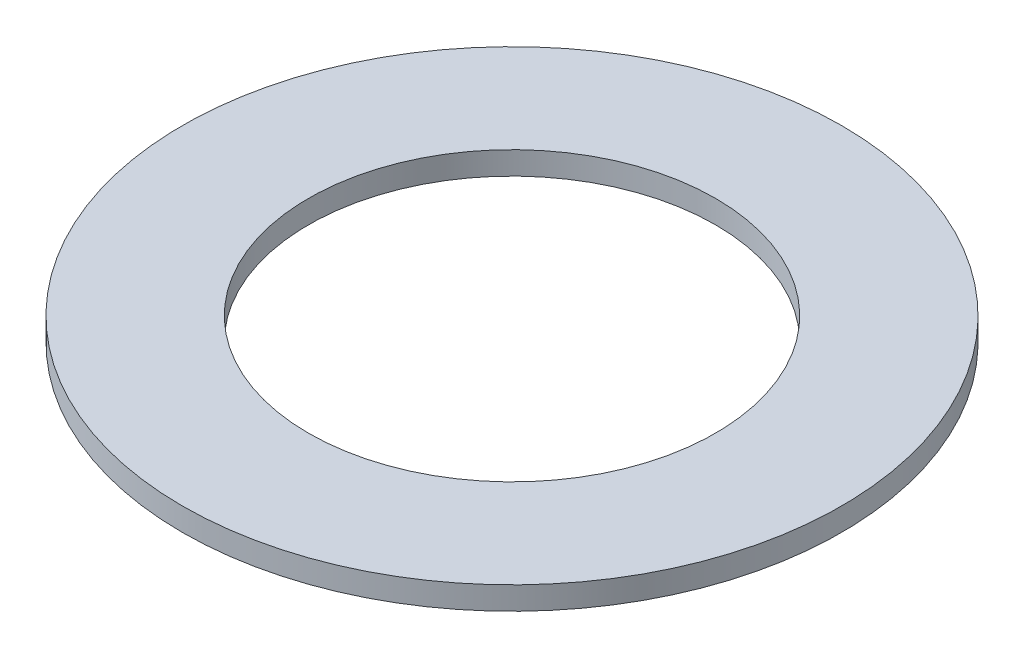
ISO-10303-21;
HEADER;
FILE_DESCRIPTION(('STEP AP214'),'2;1');
FILE_NAME('part.step','',(''),(''),'','','');
FILE_SCHEMA(('AUTOMOTIVE_DESIGN { 1 0 10303 214 1 1 1 1 }'));
ENDSEC;
DATA;
#1=APPLICATION_CONTEXT('core data for automotive mechanical design processes');
#2=APPLICATION_PROTOCOL_DEFINITION('international standard','automotive_design',2000,#1);
#3=PRODUCT_CONTEXT('',#1,'mechanical');
#4=PRODUCT('Part','Part','',(#3));
#5=PRODUCT_RELATED_PRODUCT_CATEGORY('part','',(#4));
#6=PRODUCT_DEFINITION_FORMATION('','',#4);
#7=PRODUCT_DEFINITION_CONTEXT('part definition',#1,'design');
#8=PRODUCT_DEFINITION('design','',#6,#7);
#9=PRODUCT_DEFINITION_SHAPE('','',#8);
#10=(LENGTH_UNIT() NAMED_UNIT(*) SI_UNIT(.MILLI.,.METRE.));
#11=(NAMED_UNIT(*) PLANE_ANGLE_UNIT() SI_UNIT($,.RADIAN.));
#12=(NAMED_UNIT(*) SI_UNIT($,.STERADIAN.) SOLID_ANGLE_UNIT());
#13=UNCERTAINTY_MEASURE_WITH_UNIT(LENGTH_MEASURE(1.E-05),#10,'distance_accuracy_value','');
#14=(GEOMETRIC_REPRESENTATION_CONTEXT(3) GLOBAL_UNCERTAINTY_ASSIGNED_CONTEXT((#13)) GLOBAL_UNIT_ASSIGNED_CONTEXT((#10,
#11,#12)) REPRESENTATION_CONTEXT('',''));
#15=CARTESIAN_POINT('',(0.,0.,0.));
#16=DIRECTION('',(0.,0.,1.));
#17=DIRECTION('',(1.,0.,0.));
#18=AXIS2_PLACEMENT_3D('',#15,#16,#17);
#19=CARTESIAN_POINT('',(0.,0.4,0.));
#20=DIRECTION('',(0.,1.,0.));
#21=DIRECTION('',(0.,0.,1.));
#22=AXIS2_PLACEMENT_3D('',#19,#20,#21);
#23=PLANE('',#22);
#24=CARTESIAN_POINT('',(0.,0.4,0.));
#25=DIRECTION('',(0.,1.,0.));
#26=DIRECTION('',(0.,0.,1.));
#27=AXIS2_PLACEMENT_3D('',#24,#25,#26);
#28=CIRCLE('',#27,5.75);
#29=CARTESIAN_POINT('',(0.,0.4,5.75));
#30=VERTEX_POINT('',#29);
#31=EDGE_CURVE('E10',#30,#30,#28,.T.);
#32=ORIENTED_EDGE('',*,*,#31,.T.);
#33=EDGE_LOOP('',(#32));
#34=FACE_BOUND('',#33,.T.);
#35=CARTESIAN_POINT('',(0.,0.4,0.));
#36=DIRECTION('',(0.,1.,0.));
#37=DIRECTION('',(0.,0.,1.));
#38=AXIS2_PLACEMENT_3D('',#35,#36,#37);
#39=CIRCLE('',#38,3.55);
#40=CARTESIAN_POINT('',(0.,0.4,3.55));
#41=VERTEX_POINT('',#40);
#42=EDGE_CURVE('E48',#41,#41,#39,.T.);
#43=ORIENTED_EDGE('',*,*,#42,.F.);
#44=EDGE_LOOP('',(#43));
#45=FACE_BOUND('',#44,.T.);
#46=ADVANCED_FACE('F37',(#34,#45),#23,.T.);
#47=CARTESIAN_POINT('',(0.,0.,0.));
#48=DIRECTION('',(0.,1.,0.));
#49=DIRECTION('',(0.,0.,1.));
#50=AXIS2_PLACEMENT_3D('',#47,#48,#49);
#51=PLANE('',#50);
#52=CARTESIAN_POINT('',(0.,0.,0.));
#53=DIRECTION('',(0.,1.,0.));
#54=DIRECTION('',(0.,0.,1.));
#55=AXIS2_PLACEMENT_3D('',#52,#53,#54);
#56=CIRCLE('',#55,5.75);
#57=CARTESIAN_POINT('',(0.,0.,5.75));
#58=VERTEX_POINT('',#57);
#59=EDGE_CURVE('E41',#58,#58,#56,.T.);
#60=ORIENTED_EDGE('',*,*,#59,.F.);
#61=EDGE_LOOP('',(#60));
#62=FACE_BOUND('',#61,.T.);
#63=CARTESIAN_POINT('',(0.,0.,0.));
#64=DIRECTION('',(0.,1.,0.));
#65=DIRECTION('',(0.,0.,1.));
#66=AXIS2_PLACEMENT_3D('',#63,#64,#65);
#67=CIRCLE('',#66,3.55);
#68=CARTESIAN_POINT('',(0.,0.,3.55));
#69=VERTEX_POINT('',#68);
#70=EDGE_CURVE('E50',#69,#69,#67,.T.);
#71=ORIENTED_EDGE('',*,*,#70,.T.);
#72=EDGE_LOOP('',(#71));
#73=FACE_BOUND('',#72,.T.);
#74=ADVANCED_FACE('F60',(#62,#73),#51,.F.);
#75=CARTESIAN_POINT('',(0.,0.4,0.));
#76=DIRECTION('',(0.,-1.,0.));
#77=DIRECTION('',(0.,0.,-1.));
#78=AXIS2_PLACEMENT_3D('',#75,#76,#77);
#79=CYLINDRICAL_SURFACE('',#78,5.75);
#80=ORIENTED_EDGE('',*,*,#31,.F.);
#81=EDGE_LOOP('',(#80));
#82=FACE_BOUND('',#81,.T.);
#83=ORIENTED_EDGE('',*,*,#59,.T.);
#84=EDGE_LOOP('',(#83));
#85=FACE_BOUND('',#84,.T.);
#86=ADVANCED_FACE('F39',(#82,#85),#79,.T.);
#87=CARTESIAN_POINT('',(0.,0.4,0.));
#88=DIRECTION('',(0.,-1.,0.));
#89=DIRECTION('',(0.,0.,-1.));
#90=AXIS2_PLACEMENT_3D('',#87,#88,#89);
#91=CYLINDRICAL_SURFACE('',#90,3.55);
#92=ORIENTED_EDGE('',*,*,#42,.T.);
#93=EDGE_LOOP('',(#92));
#94=FACE_BOUND('',#93,.T.);
#95=ORIENTED_EDGE('',*,*,#70,.F.);
#96=EDGE_LOOP('',(#95));
#97=FACE_BOUND('',#96,.T.);
#98=ADVANCED_FACE('F56',(#94,#97),#91,.F.);
#99=CLOSED_SHELL('',(#46,#74,#86,#98));
#100=MANIFOLD_SOLID_BREP('B2',#99);
#101=ADVANCED_BREP_SHAPE_REPRESENTATION('',(#18,#100),#14);
#102=SHAPE_DEFINITION_REPRESENTATION(#9,#101);
ENDSEC;
END-ISO-10303-21;
